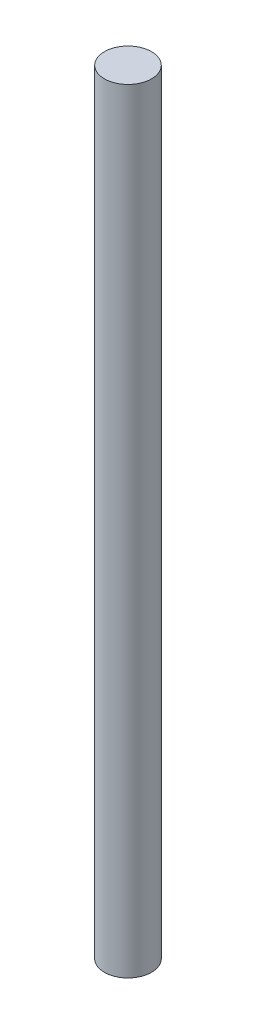
ISO-10303-21;
HEADER;
FILE_DESCRIPTION(('STEP AP214'),'2;1');
FILE_NAME('part.step','',(''),(''),'','','');
FILE_SCHEMA(('AUTOMOTIVE_DESIGN { 1 0 10303 214 1 1 1 1 }'));
ENDSEC;
DATA;
#1=APPLICATION_CONTEXT('core data for automotive mechanical design processes');
#2=APPLICATION_PROTOCOL_DEFINITION('international standard','automotive_design',2000,#1);
#3=PRODUCT_CONTEXT('',#1,'mechanical');
#4=PRODUCT('Part','Part','',(#3));
#5=PRODUCT_RELATED_PRODUCT_CATEGORY('part','',(#4));
#6=PRODUCT_DEFINITION_FORMATION('','',#4);
#7=PRODUCT_DEFINITION_CONTEXT('part definition',#1,'design');
#8=PRODUCT_DEFINITION('design','',#6,#7);
#9=PRODUCT_DEFINITION_SHAPE('','',#8);
#10=(LENGTH_UNIT() NAMED_UNIT(*) SI_UNIT(.MILLI.,.METRE.));
#11=(NAMED_UNIT(*) PLANE_ANGLE_UNIT() SI_UNIT($,.RADIAN.));
#12=(NAMED_UNIT(*) SI_UNIT($,.STERADIAN.) SOLID_ANGLE_UNIT());
#13=UNCERTAINTY_MEASURE_WITH_UNIT(LENGTH_MEASURE(1.E-05),#10,'distance_accuracy_value','');
#14=(GEOMETRIC_REPRESENTATION_CONTEXT(3) GLOBAL_UNCERTAINTY_ASSIGNED_CONTEXT((#13)) GLOBAL_UNIT_ASSIGNED_CONTEXT((#10,
#11,#12)) REPRESENTATION_CONTEXT('',''));
#15=CARTESIAN_POINT('',(0.,0.,0.));
#16=DIRECTION('',(0.,0.,1.));
#17=DIRECTION('',(1.,0.,0.));
#18=AXIS2_PLACEMENT_3D('',#15,#16,#17);
#19=CARTESIAN_POINT('',(0.,165.1,0.));
#20=DIRECTION('',(0.,-1.,0.));
#21=DIRECTION('',(0.,0.,-1.));
#22=AXIS2_PLACEMENT_3D('',#19,#20,#21);
#23=CYLINDRICAL_SURFACE('',#22,5.02632183727009);
#24=CARTESIAN_POINT('',(0.,165.1,0.));
#25=DIRECTION('',(0.,1.,0.));
#26=DIRECTION('',(0.,0.,1.));
#27=AXIS2_PLACEMENT_3D('',#24,#25,#26);
#28=CIRCLE('',#27,5.02632183727009);
#29=CARTESIAN_POINT('',(0.,165.1,5.02632183727009));
#30=VERTEX_POINT('',#29);
#31=EDGE_CURVE('E10',#30,#30,#28,.T.);
#32=ORIENTED_EDGE('',*,*,#31,.F.);
#33=EDGE_LOOP('',(#32));
#34=FACE_BOUND('',#33,.T.);
#35=CARTESIAN_POINT('',(0.,0.,0.));
#36=DIRECTION('',(0.,1.,0.));
#37=DIRECTION('',(0.,0.,1.));
#38=AXIS2_PLACEMENT_3D('',#35,#36,#37);
#39=CIRCLE('',#38,5.02632183727009);
#40=CARTESIAN_POINT('',(0.,0.,5.02632183727009));
#41=VERTEX_POINT('',#40);
#42=EDGE_CURVE('E34',#41,#41,#39,.T.);
#43=ORIENTED_EDGE('',*,*,#42,.T.);
#44=EDGE_LOOP('',(#43));
#45=FACE_BOUND('',#44,.T.);
#46=ADVANCED_FACE('F31',(#34,#45),#23,.T.);
#47=CARTESIAN_POINT('',(0.,165.1,0.));
#48=DIRECTION('',(0.,1.,0.));
#49=DIRECTION('',(0.,0.,1.));
#50=AXIS2_PLACEMENT_3D('',#47,#48,#49);
#51=PLANE('',#50);
#52=ORIENTED_EDGE('',*,*,#31,.T.);
#53=EDGE_LOOP('',(#52));
#54=FACE_BOUND('',#53,.T.);
#55=ADVANCED_FACE('F46',(#54),#51,.T.);
#56=CARTESIAN_POINT('',(0.,0.,0.));
#57=DIRECTION('',(0.,1.,0.));
#58=DIRECTION('',(0.,0.,1.));
#59=AXIS2_PLACEMENT_3D('',#56,#57,#58);
#60=PLANE('',#59);
#61=ORIENTED_EDGE('',*,*,#42,.F.);
#62=EDGE_LOOP('',(#61));
#63=FACE_BOUND('',#62,.T.);
#64=ADVANCED_FACE('F44',(#63),#60,.F.);
#65=CLOSED_SHELL('',(#46,#55,#64));
#66=MANIFOLD_SOLID_BREP('B2',#65);
#67=ADVANCED_BREP_SHAPE_REPRESENTATION('',(#18,#66),#14);
#68=SHAPE_DEFINITION_REPRESENTATION(#9,#67);
ENDSEC;
END-ISO-10303-21;
